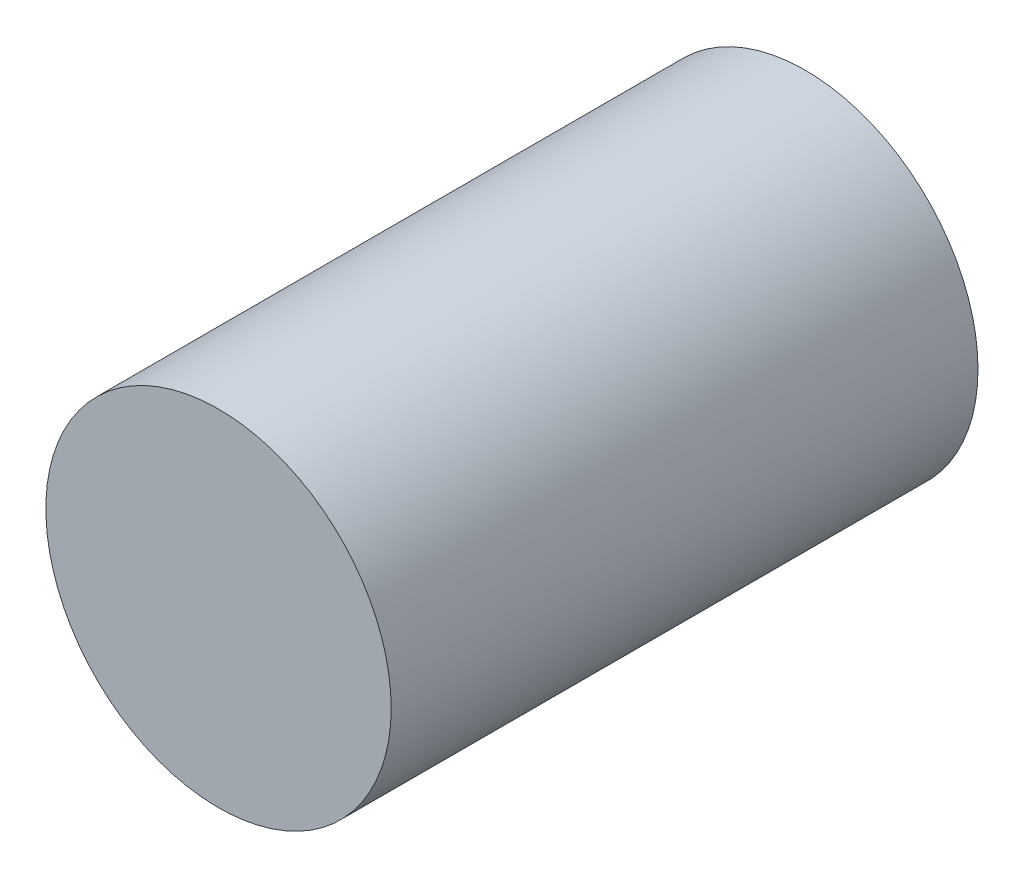
ISO-10303-21;
HEADER;
FILE_DESCRIPTION(('STEP AP214'),'2;1');
FILE_NAME('part.step','',(''),(''),'','','');
FILE_SCHEMA(('AUTOMOTIVE_DESIGN { 1 0 10303 214 1 1 1 1 }'));
ENDSEC;
DATA;
#1=APPLICATION_CONTEXT('core data for automotive mechanical design processes');
#2=APPLICATION_PROTOCOL_DEFINITION('international standard','automotive_design',2000,#1);
#3=PRODUCT_CONTEXT('',#1,'mechanical');
#4=PRODUCT('Part','Part','',(#3));
#5=PRODUCT_RELATED_PRODUCT_CATEGORY('part','',(#4));
#6=PRODUCT_DEFINITION_FORMATION('','',#4);
#7=PRODUCT_DEFINITION_CONTEXT('part definition',#1,'design');
#8=PRODUCT_DEFINITION('design','',#6,#7);
#9=PRODUCT_DEFINITION_SHAPE('','',#8);
#10=(LENGTH_UNIT() NAMED_UNIT(*) SI_UNIT(.MILLI.,.METRE.));
#11=(NAMED_UNIT(*) PLANE_ANGLE_UNIT() SI_UNIT($,.RADIAN.));
#12=(NAMED_UNIT(*) SI_UNIT($,.STERADIAN.) SOLID_ANGLE_UNIT());
#13=UNCERTAINTY_MEASURE_WITH_UNIT(LENGTH_MEASURE(1.E-05),#10,'distance_accuracy_value','');
#14=(GEOMETRIC_REPRESENTATION_CONTEXT(3) GLOBAL_UNCERTAINTY_ASSIGNED_CONTEXT((#13)) GLOBAL_UNIT_ASSIGNED_CONTEXT((#10,
#11,#12)) REPRESENTATION_CONTEXT('',''));
#15=CARTESIAN_POINT('',(0.,0.,0.));
#16=DIRECTION('',(0.,0.,1.));
#17=DIRECTION('',(1.,0.,0.));
#18=AXIS2_PLACEMENT_3D('',#15,#16,#17);
#19=CARTESIAN_POINT('',(0.,0.,-12.055));
#20=DIRECTION('',(0.,0.,1.));
#21=DIRECTION('',(1.,0.,0.));
#22=AXIS2_PLACEMENT_3D('',#19,#20,#21);
#23=CYLINDRICAL_SURFACE('',#22,6.35);
#24=CARTESIAN_POINT('',(0.,0.,-12.055));
#25=DIRECTION('',(0.,0.,1.));
#26=DIRECTION('',(1.,0.,0.));
#27=AXIS2_PLACEMENT_3D('',#24,#25,#26);
#28=CIRCLE('',#27,6.35);
#29=CARTESIAN_POINT('',(6.35,0.,-12.055));
#30=VERTEX_POINT('',#29);
#31=EDGE_CURVE('E11',#30,#30,#28,.T.);
#32=ORIENTED_EDGE('',*,*,#31,.T.);
#33=EDGE_LOOP('',(#32));
#34=FACE_BOUND('',#33,.T.);
#35=CARTESIAN_POINT('',(0.,0.,9.525));
#36=DIRECTION('',(0.,0.,1.));
#37=DIRECTION('',(1.,0.,0.));
#38=AXIS2_PLACEMENT_3D('',#35,#36,#37);
#39=CIRCLE('',#38,6.35);
#40=CARTESIAN_POINT('',(6.35,0.,9.525));
#41=VERTEX_POINT('',#40);
#42=EDGE_CURVE('E46',#41,#41,#39,.T.);
#43=ORIENTED_EDGE('',*,*,#42,.F.);
#44=EDGE_LOOP('',(#43));
#45=FACE_BOUND('',#44,.T.);
#46=ADVANCED_FACE('F43',(#34,#45),#23,.T.);
#47=CARTESIAN_POINT('',(0.,0.,-12.055));
#48=DIRECTION('',(0.,0.,1.));
#49=DIRECTION('',(1.,0.,0.));
#50=AXIS2_PLACEMENT_3D('',#47,#48,#49);
#51=PLANE('',#50);
#52=CARTESIAN_POINT('',(1.778,0.,-12.055));
#53=DIRECTION('',(0.,0.,-1.));
#54=DIRECTION('',(-1.,0.,0.));
#55=AXIS2_PLACEMENT_3D('',#52,#53,#54);
#56=CIRCLE('',#55,1.905);
#57=CARTESIAN_POINT('',(1.778,1.905,-12.055));
#58=VERTEX_POINT('',#57);
#59=CARTESIAN_POINT('',(1.778,-1.905,-12.055));
#60=VERTEX_POINT('',#59);
#61=EDGE_CURVE('E105',#58,#60,#56,.T.);
#62=ORIENTED_EDGE('',*,*,#61,.F.);
#63=DIRECTION('',(1.,0.,0.));
#64=VECTOR('',#63,1.);
#65=CARTESIAN_POINT('',(1.778,1.905,-12.055));
#66=LINE('',#65,#64);
#67=CARTESIAN_POINT('',(-1.778,1.905,-12.055));
#68=VERTEX_POINT('',#67);
#69=EDGE_CURVE('E99',#68,#58,#66,.T.);
#70=ORIENTED_EDGE('',*,*,#69,.F.);
#71=CARTESIAN_POINT('',(-1.778,0.,-12.055));
#72=DIRECTION('',(0.,0.,-1.));
#73=DIRECTION('',(1.,0.,0.));
#74=AXIS2_PLACEMENT_3D('',#71,#72,#73);
#75=CIRCLE('',#74,1.905);
#76=CARTESIAN_POINT('',(-1.778,-1.905,-12.055));
#77=VERTEX_POINT('',#76);
#78=EDGE_CURVE('E109',#77,#68,#75,.T.);
#79=ORIENTED_EDGE('',*,*,#78,.F.);
#80=DIRECTION('',(-1.,0.,0.));
#81=VECTOR('',#80,1.);
#82=CARTESIAN_POINT('',(1.778,-1.905,-12.055));
#83=LINE('',#82,#81);
#84=EDGE_CURVE('E57',#60,#77,#83,.T.);
#85=ORIENTED_EDGE('',*,*,#84,.F.);
#86=EDGE_LOOP('',(#62,#70,#79,#85));
#87=FACE_BOUND('',#86,.T.);
#88=ORIENTED_EDGE('',*,*,#31,.F.);
#89=EDGE_LOOP('',(#88));
#90=FACE_BOUND('',#89,.T.);
#91=ADVANCED_FACE('F123',(#87,#90),#51,.F.);
#92=CARTESIAN_POINT('',(0.,0.,9.525));
#93=DIRECTION('',(0.,0.,1.));
#94=DIRECTION('',(1.,0.,0.));
#95=AXIS2_PLACEMENT_3D('',#92,#93,#94);
#96=PLANE('',#95);
#97=ORIENTED_EDGE('',*,*,#42,.T.);
#98=EDGE_LOOP('',(#97));
#99=FACE_BOUND('',#98,.T.);
#100=ADVANCED_FACE('F120',(#99),#96,.T.);
#101=CARTESIAN_POINT('',(0.,0.,3.175));
#102=DIRECTION('',(0.,0.,1.));
#103=DIRECTION('',(1.,0.,0.));
#104=AXIS2_PLACEMENT_3D('',#101,#102,#103);
#105=PLANE('',#104);
#106=CARTESIAN_POINT('',(-1.778,0.,3.175));
#107=DIRECTION('',(0.,0.,1.));
#108=DIRECTION('',(1.,0.,0.));
#109=AXIS2_PLACEMENT_3D('',#106,#107,#108);
#110=CIRCLE('',#109,1.905);
#111=CARTESIAN_POINT('',(-1.778,-1.905,3.175));
#112=VERTEX_POINT('',#111);
#113=CARTESIAN_POINT('',(-1.778,1.905,3.175));
#114=VERTEX_POINT('',#113);
#115=EDGE_CURVE('E103',#112,#114,#110,.F.);
#116=ORIENTED_EDGE('',*,*,#115,.T.);
#117=DIRECTION('',(1.,0.,0.));
#118=VECTOR('',#117,1.);
#119=CARTESIAN_POINT('',(1.778,1.905,3.175));
#120=LINE('',#119,#118);
#121=CARTESIAN_POINT('',(1.778,1.905,3.175));
#122=VERTEX_POINT('',#121);
#123=EDGE_CURVE('E81',#114,#122,#120,.T.);
#124=ORIENTED_EDGE('',*,*,#123,.T.);
#125=CARTESIAN_POINT('',(1.778,0.,3.175));
#126=DIRECTION('',(0.,0.,1.));
#127=DIRECTION('',(1.,0.,0.));
#128=AXIS2_PLACEMENT_3D('',#125,#126,#127);
#129=CIRCLE('',#128,1.905);
#130=CARTESIAN_POINT('',(1.778,-1.905,3.175));
#131=VERTEX_POINT('',#130);
#132=EDGE_CURVE('E89',#122,#131,#129,.F.);
#133=ORIENTED_EDGE('',*,*,#132,.T.);
#134=DIRECTION('',(-1.,0.,0.));
#135=VECTOR('',#134,1.);
#136=CARTESIAN_POINT('',(1.778,-1.905,3.175));
#137=LINE('',#136,#135);
#138=EDGE_CURVE('E113',#131,#112,#137,.T.);
#139=ORIENTED_EDGE('',*,*,#138,.T.);
#140=EDGE_LOOP('',(#116,#124,#133,#139));
#141=FACE_BOUND('',#140,.T.);
#142=ADVANCED_FACE('F102',(#141),#105,.F.);
#143=CARTESIAN_POINT('',(1.778,1.905,11.4680124803958));
#144=DIRECTION('',(0.,1.,0.));
#145=DIRECTION('',(-1.,0.,0.));
#146=AXIS2_PLACEMENT_3D('',#143,#144,#145);
#147=PLANE('',#146);
#148=DIRECTION('',(0.,0.,-1.));
#149=VECTOR('',#148,1.);
#150=CARTESIAN_POINT('',(-1.778,1.905,11.4680124803958));
#151=LINE('',#150,#149);
#152=EDGE_CURVE('E66',#114,#68,#151,.T.);
#153=ORIENTED_EDGE('',*,*,#152,.T.);
#154=ORIENTED_EDGE('',*,*,#69,.T.);
#155=DIRECTION('',(0.,0.,-1.));
#156=VECTOR('',#155,1.);
#157=CARTESIAN_POINT('',(1.778,1.905,11.4680124803958));
#158=LINE('',#157,#156);
#159=EDGE_CURVE('E92',#122,#58,#158,.T.);
#160=ORIENTED_EDGE('',*,*,#159,.F.);
#161=ORIENTED_EDGE('',*,*,#123,.F.);
#162=EDGE_LOOP('',(#153,#154,#160,#161));
#163=FACE_BOUND('',#162,.T.);
#164=ADVANCED_FACE('F97',(#163),#147,.F.);
#165=CARTESIAN_POINT('',(1.778,0.,11.4680124803958));
#166=DIRECTION('',(0.,0.,-1.));
#167=DIRECTION('',(-1.,0.,0.));
#168=AXIS2_PLACEMENT_3D('',#165,#166,#167);
#169=CYLINDRICAL_SURFACE('',#168,1.905);
#170=ORIENTED_EDGE('',*,*,#159,.T.);
#171=ORIENTED_EDGE('',*,*,#61,.T.);
#172=DIRECTION('',(0.,0.,-1.));
#173=VECTOR('',#172,1.);
#174=CARTESIAN_POINT('',(1.778,-1.905,11.4680124803958));
#175=LINE('',#174,#173);
#176=EDGE_CURVE('E93',#131,#60,#175,.T.);
#177=ORIENTED_EDGE('',*,*,#176,.F.);
#178=ORIENTED_EDGE('',*,*,#132,.F.);
#179=EDGE_LOOP('',(#170,#171,#177,#178));
#180=FACE_BOUND('',#179,.T.);
#181=ADVANCED_FACE('F90',(#180),#169,.F.);
#182=CARTESIAN_POINT('',(1.778,-1.905,11.4680124803958));
#183=DIRECTION('',(0.,-1.,0.));
#184=DIRECTION('',(1.,0.,0.));
#185=AXIS2_PLACEMENT_3D('',#182,#183,#184);
#186=PLANE('',#185);
#187=ORIENTED_EDGE('',*,*,#176,.T.);
#188=ORIENTED_EDGE('',*,*,#84,.T.);
#189=DIRECTION('',(0.,0.,-1.));
#190=VECTOR('',#189,1.);
#191=CARTESIAN_POINT('',(-1.778,-1.905,11.4680124803958));
#192=LINE('',#191,#190);
#193=EDGE_CURVE('E112',#112,#77,#192,.T.);
#194=ORIENTED_EDGE('',*,*,#193,.F.);
#195=ORIENTED_EDGE('',*,*,#138,.F.);
#196=EDGE_LOOP('',(#187,#188,#194,#195));
#197=FACE_BOUND('',#196,.T.);
#198=ADVANCED_FACE('F144',(#197),#186,.F.);
#199=CARTESIAN_POINT('',(-1.778,0.,11.4680124803958));
#200=DIRECTION('',(0.,0.,-1.));
#201=DIRECTION('',(-1.,0.,0.));
#202=AXIS2_PLACEMENT_3D('',#199,#200,#201);
#203=CYLINDRICAL_SURFACE('',#202,1.905);
#204=ORIENTED_EDGE('',*,*,#193,.T.);
#205=ORIENTED_EDGE('',*,*,#78,.T.);
#206=ORIENTED_EDGE('',*,*,#152,.F.);
#207=ORIENTED_EDGE('',*,*,#115,.F.);
#208=EDGE_LOOP('',(#204,#205,#206,#207));
#209=FACE_BOUND('',#208,.T.);
#210=ADVANCED_FACE('F147',(#209),#203,.F.);
#211=CLOSED_SHELL('',(#46,#91,#100,#142,#164,#181,#198,#210));
#212=MANIFOLD_SOLID_BREP('B2',#211);
#213=ADVANCED_BREP_SHAPE_REPRESENTATION('',(#18,#212),#14);
#214=SHAPE_DEFINITION_REPRESENTATION(#9,#213);
ENDSEC;
END-ISO-10303-21;
